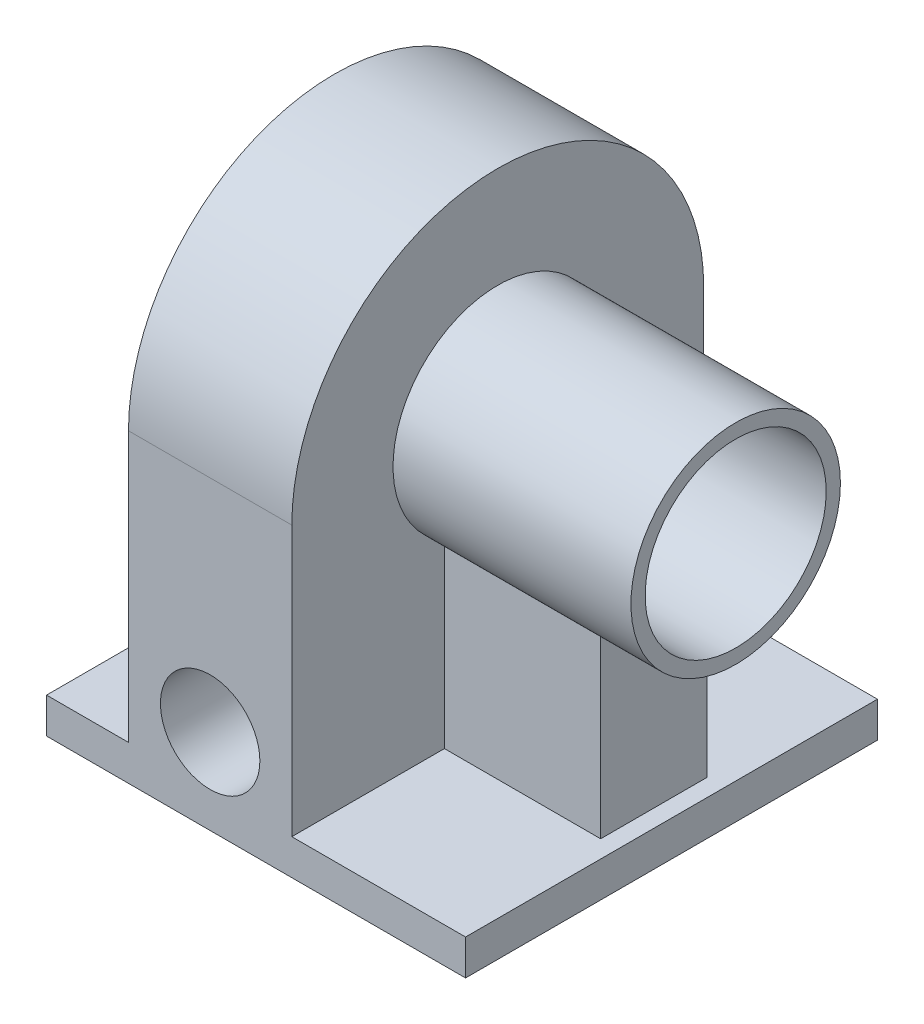
ISO-10303-21;
HEADER;
FILE_DESCRIPTION(('STEP AP214'),'2;1');
FILE_NAME('part.step','',(''),(''),'','','');
FILE_SCHEMA(('AUTOMOTIVE_DESIGN { 1 0 10303 214 1 1 1 1 }'));
ENDSEC;
DATA;
#1=APPLICATION_CONTEXT('core data for automotive mechanical design processes');
#2=APPLICATION_PROTOCOL_DEFINITION('international standard','automotive_design',2000,#1);
#3=PRODUCT_CONTEXT('',#1,'mechanical');
#4=PRODUCT('Part','Part','',(#3));
#5=PRODUCT_RELATED_PRODUCT_CATEGORY('part','',(#4));
#6=PRODUCT_DEFINITION_FORMATION('','',#4);
#7=PRODUCT_DEFINITION_CONTEXT('part definition',#1,'design');
#8=PRODUCT_DEFINITION('design','',#6,#7);
#9=PRODUCT_DEFINITION_SHAPE('','',#8);
#10=(LENGTH_UNIT() NAMED_UNIT(*) SI_UNIT(.MILLI.,.METRE.));
#11=(NAMED_UNIT(*) PLANE_ANGLE_UNIT() SI_UNIT($,.RADIAN.));
#12=(NAMED_UNIT(*) SI_UNIT($,.STERADIAN.) SOLID_ANGLE_UNIT());
#13=UNCERTAINTY_MEASURE_WITH_UNIT(LENGTH_MEASURE(1.E-05),#10,'distance_accuracy_value','');
#14=(GEOMETRIC_REPRESENTATION_CONTEXT(3) GLOBAL_UNCERTAINTY_ASSIGNED_CONTEXT((#13)) GLOBAL_UNIT_ASSIGNED_CONTEXT((#10,
#11,#12)) REPRESENTATION_CONTEXT('',''));
#15=CARTESIAN_POINT('',(0.,0.,0.));
#16=DIRECTION('',(0.,0.,1.));
#17=DIRECTION('',(1.,0.,0.));
#18=AXIS2_PLACEMENT_3D('',#15,#16,#17);
#19=CARTESIAN_POINT('',(-59.0733122187031,10.,-116.));
#20=DIRECTION('',(0.,1.,0.));
#21=DIRECTION('',(0.,0.,1.));
#22=AXIS2_PLACEMENT_3D('',#19,#20,#21);
#23=PLANE('',#22);
#24=DIRECTION('',(0.,0.,-1.));
#25=VECTOR('',#24,1.);
#26=CARTESIAN_POINT('',(54.,10.,-72.9751034213761));
#27=LINE('',#26,#25);
#28=CARTESIAN_POINT('',(54.,10.,-42.9751034213761));
#29=VERTEX_POINT('',#28);
#30=CARTESIAN_POINT('',(54.,10.,-72.9751034213761));
#31=VERTEX_POINT('',#30);
#32=EDGE_CURVE('E54',#29,#31,#27,.T.);
#33=ORIENTED_EDGE('',*,*,#32,.F.);
#34=DIRECTION('',(1.,0.,0.));
#35=VECTOR('',#34,1.);
#36=CARTESIAN_POINT('',(10.,10.,-42.9751034213761));
#37=LINE('',#36,#35);
#38=CARTESIAN_POINT('',(10.,10.,-42.9751034213761));
#39=VERTEX_POINT('',#38);
#40=EDGE_CURVE('E295',#39,#29,#37,.T.);
#41=ORIENTED_EDGE('',*,*,#40,.F.);
#42=DIRECTION('',(0.,0.,-1.));
#43=VECTOR('',#42,1.);
#44=CARTESIAN_POINT('',(10.,10.,0.));
#45=LINE('',#44,#43);
#46=CARTESIAN_POINT('',(10.,10.,0.));
#47=VERTEX_POINT('',#46);
#48=EDGE_CURVE('E169',#47,#39,#45,.T.);
#49=ORIENTED_EDGE('',*,*,#48,.F.);
#50=DIRECTION('',(-1.,0.,0.));
#51=VECTOR('',#50,1.);
#52=CARTESIAN_POINT('',(-59.0733122187031,10.,0.));
#53=LINE('',#52,#51);
#54=CARTESIAN_POINT('',(58.9266877812969,10.,0.));
#55=VERTEX_POINT('',#54);
#56=EDGE_CURVE('E214',#55,#47,#53,.T.);
#57=ORIENTED_EDGE('',*,*,#56,.F.);
#58=DIRECTION('',(0.,0.,1.));
#59=VECTOR('',#58,1.);
#60=CARTESIAN_POINT('',(58.9266877812969,10.,-116.));
#61=LINE('',#60,#59);
#62=CARTESIAN_POINT('',(58.9266877812969,10.,-116.));
#63=VERTEX_POINT('',#62);
#64=EDGE_CURVE('E224',#63,#55,#61,.T.);
#65=ORIENTED_EDGE('',*,*,#64,.F.);
#66=DIRECTION('',(-1.,0.,0.));
#67=VECTOR('',#66,1.);
#68=CARTESIAN_POINT('',(-59.0733122187031,10.,-116.));
#69=LINE('',#68,#67);
#70=CARTESIAN_POINT('',(10.,10.,-116.));
#71=VERTEX_POINT('',#70);
#72=EDGE_CURVE('E201',#63,#71,#69,.T.);
#73=ORIENTED_EDGE('',*,*,#72,.T.);
#74=CARTESIAN_POINT('',(10.,10.,-72.9751034213761));
#75=VERTEX_POINT('',#74);
#76=EDGE_CURVE('E186',#75,#71,#45,.T.);
#77=ORIENTED_EDGE('',*,*,#76,.F.);
#78=DIRECTION('',(-1.,0.,0.));
#79=VECTOR('',#78,1.);
#80=CARTESIAN_POINT('',(10.,10.,-72.9751034213761));
#81=LINE('',#80,#79);
#82=EDGE_CURVE('E59',#31,#75,#81,.T.);
#83=ORIENTED_EDGE('',*,*,#82,.F.);
#84=EDGE_LOOP('',(#33,#41,#49,#57,#65,#73,#77,#83));
#85=FACE_BOUND('',#84,.T.);
#86=ADVANCED_FACE('F39',(#85),#23,.T.);
#87=CARTESIAN_POINT('',(10.,0.,0.));
#88=DIRECTION('',(1.,0.,0.));
#89=DIRECTION('',(0.,0.,-1.));
#90=AXIS2_PLACEMENT_3D('',#87,#88,#89);
#91=PLANE('',#90);
#92=ORIENTED_EDGE('',*,*,#48,.T.);
#93=DIRECTION('',(0.,-1.,0.));
#94=VECTOR('',#93,1.);
#95=CARTESIAN_POINT('',(10.,65.,-42.9751034213761));
#96=LINE('',#95,#94);
#97=CARTESIAN_POINT('',(10.,60.6129465514082,-42.9751034213761));
#98=VERTEX_POINT('',#97);
#99=EDGE_CURVE('E147',#98,#39,#96,.T.);
#100=ORIENTED_EDGE('',*,*,#99,.F.);
#101=CARTESIAN_POINT('',(10.,86.,-58.));
#102=DIRECTION('',(1.,0.,0.));
#103=DIRECTION('',(0.,0.,-1.));
#104=AXIS2_PLACEMENT_3D('',#101,#102,#103);
#105=CIRCLE('',#104,29.5);
#106=CARTESIAN_POINT('',(10.,60.5835431753541,-72.9751034213761));
#107=VERTEX_POINT('',#106);
#108=EDGE_CURVE('E153',#107,#98,#105,.T.);
#109=ORIENTED_EDGE('',*,*,#108,.F.);
#110=DIRECTION('',(0.,-1.,0.));
#111=VECTOR('',#110,1.);
#112=CARTESIAN_POINT('',(10.,65.,-72.9751034213761));
#113=LINE('',#112,#111);
#114=EDGE_CURVE('E142',#107,#75,#113,.T.);
#115=ORIENTED_EDGE('',*,*,#114,.T.);
#116=ORIENTED_EDGE('',*,*,#76,.T.);
#117=DIRECTION('',(0.,1.,0.));
#118=VECTOR('',#117,1.);
#119=CARTESIAN_POINT('',(10.,0.,-116.));
#120=LINE('',#119,#118);
#121=CARTESIAN_POINT('',(10.,86.,-116.));
#122=VERTEX_POINT('',#121);
#123=EDGE_CURVE('E162',#71,#122,#120,.T.);
#124=ORIENTED_EDGE('',*,*,#123,.T.);
#125=CARTESIAN_POINT('',(10.,86.,-58.));
#126=DIRECTION('',(1.,0.,0.));
#127=DIRECTION('',(0.,0.,-1.));
#128=AXIS2_PLACEMENT_3D('',#125,#126,#127);
#129=CIRCLE('',#128,58.);
#130=CARTESIAN_POINT('',(10.,86.,0.));
#131=VERTEX_POINT('',#130);
#132=EDGE_CURVE('E180',#122,#131,#129,.T.);
#133=ORIENTED_EDGE('',*,*,#132,.T.);
#134=DIRECTION('',(0.,1.,0.));
#135=VECTOR('',#134,1.);
#136=CARTESIAN_POINT('',(10.,0.,0.));
#137=LINE('',#136,#135);
#138=EDGE_CURVE('E183',#47,#131,#137,.T.);
#139=ORIENTED_EDGE('',*,*,#138,.F.);
#140=EDGE_LOOP('',(#92,#100,#109,#115,#116,#124,#133,#139));
#141=FACE_BOUND('',#140,.T.);
#142=ADVANCED_FACE('F237',(#141),#91,.T.);
#143=CARTESIAN_POINT('',(77.,86.,-58.));
#144=DIRECTION('',(-1.,0.,0.));
#145=DIRECTION('',(0.,0.,1.));
#146=AXIS2_PLACEMENT_3D('',#143,#144,#145);
#147=CYLINDRICAL_SURFACE('',#146,29.5);
#148=CARTESIAN_POINT('',(77.,86.,-58.));
#149=DIRECTION('',(1.,0.,0.));
#150=DIRECTION('',(0.,0.,-1.));
#151=AXIS2_PLACEMENT_3D('',#148,#149,#150);
#152=CIRCLE('',#151,29.5);
#153=CARTESIAN_POINT('',(77.,86.,-87.5));
#154=VERTEX_POINT('',#153);
#155=EDGE_CURVE('E154',#154,#154,#152,.T.);
#156=ORIENTED_EDGE('',*,*,#155,.F.);
#157=EDGE_LOOP('',(#156));
#158=FACE_BOUND('',#157,.T.);
#159=DIRECTION('',(-1.,0.,0.));
#160=VECTOR('',#159,1.);
#161=CARTESIAN_POINT('',(77.,60.6129465514082,-42.9751034213761));
#162=LINE('',#161,#160);
#163=CARTESIAN_POINT('',(54.,60.6129465514082,-42.9751034213761));
#164=VERTEX_POINT('',#163);
#165=EDGE_CURVE('E11',#164,#98,#162,.T.);
#166=ORIENTED_EDGE('',*,*,#165,.F.);
#167=CARTESIAN_POINT('',(54.,86.,-58.));
#168=DIRECTION('',(-1.,0.,0.));
#169=DIRECTION('',(0.,0.,1.));
#170=AXIS2_PLACEMENT_3D('',#167,#168,#169);
#171=CIRCLE('',#170,29.5);
#172=CARTESIAN_POINT('',(54.,60.5835431753541,-72.9751034213761));
#173=VERTEX_POINT('',#172);
#174=EDGE_CURVE('E127',#173,#164,#171,.T.);
#175=ORIENTED_EDGE('',*,*,#174,.F.);
#176=DIRECTION('',(-1.,0.,0.));
#177=VECTOR('',#176,1.);
#178=CARTESIAN_POINT('',(77.,60.5835431753541,-72.9751034213761));
#179=LINE('',#178,#177);
#180=EDGE_CURVE('E47',#107,#173,#179,.F.);
#181=ORIENTED_EDGE('',*,*,#180,.F.);
#182=ORIENTED_EDGE('',*,*,#108,.T.);
#183=EDGE_LOOP('',(#166,#175,#181,#182));
#184=FACE_BOUND('',#183,.T.);
#185=ADVANCED_FACE('F129',(#158,#184),#147,.T.);
#186=CARTESIAN_POINT('',(77.,86.,-58.));
#187=DIRECTION('',(-1.,0.,0.));
#188=DIRECTION('',(0.,0.,1.));
#189=AXIS2_PLACEMENT_3D('',#186,#187,#188);
#190=CYLINDRICAL_SURFACE('',#189,25.5);
#191=CARTESIAN_POINT('',(9.99999999999999,86.,-58.));
#192=DIRECTION('',(1.,0.,0.));
#193=DIRECTION('',(0.,0.,-1.));
#194=AXIS2_PLACEMENT_3D('',#191,#192,#193);
#195=CIRCLE('',#194,25.5);
#196=CARTESIAN_POINT('',(9.99999999999999,86.,-83.5));
#197=VERTEX_POINT('',#196);
#198=EDGE_CURVE('E143',#197,#197,#195,.F.);
#199=ORIENTED_EDGE('',*,*,#198,.T.);
#200=EDGE_LOOP('',(#199));
#201=FACE_BOUND('',#200,.T.);
#202=CARTESIAN_POINT('',(77.,86.,-58.));
#203=DIRECTION('',(1.,0.,0.));
#204=DIRECTION('',(0.,0.,-1.));
#205=AXIS2_PLACEMENT_3D('',#202,#203,#204);
#206=CIRCLE('',#205,25.5);
#207=CARTESIAN_POINT('',(77.,86.,-83.5));
#208=VERTEX_POINT('',#207);
#209=EDGE_CURVE('E135',#208,#208,#206,.T.);
#210=ORIENTED_EDGE('',*,*,#209,.T.);
#211=EDGE_LOOP('',(#210));
#212=FACE_BOUND('',#211,.T.);
#213=ADVANCED_FACE('F230',(#201,#212),#190,.F.);
#214=ORIENTED_EDGE('',*,*,#198,.F.);
#215=EDGE_LOOP('',(#214));
#216=FACE_BOUND('',#215,.T.);
#217=ADVANCED_FACE('F233',(#216),#91,.T.);
#218=CARTESIAN_POINT('',(-36.,10.,0.));
#219=VERTEX_POINT('',#218);
#220=CARTESIAN_POINT('',(-59.0733122187031,10.,0.));
#221=VERTEX_POINT('',#220);
#222=EDGE_CURVE('E213',#219,#221,#53,.T.);
#223=ORIENTED_EDGE('',*,*,#222,.F.);
#224=DIRECTION('',(0.,0.,-1.));
#225=VECTOR('',#224,1.);
#226=CARTESIAN_POINT('',(-36.,10.,0.));
#227=LINE('',#226,#225);
#228=CARTESIAN_POINT('',(-36.,10.,-116.));
#229=VERTEX_POINT('',#228);
#230=EDGE_CURVE('E174',#219,#229,#227,.T.);
#231=ORIENTED_EDGE('',*,*,#230,.T.);
#232=CARTESIAN_POINT('',(-59.0733122187031,10.,-116.));
#233=VERTEX_POINT('',#232);
#234=EDGE_CURVE('E200',#229,#233,#69,.T.);
#235=ORIENTED_EDGE('',*,*,#234,.T.);
#236=DIRECTION('',(0.,0.,1.));
#237=VECTOR('',#236,1.);
#238=CARTESIAN_POINT('',(-59.0733122187031,10.,-116.));
#239=LINE('',#238,#237);
#240=EDGE_CURVE('E221',#233,#221,#239,.T.);
#241=ORIENTED_EDGE('',*,*,#240,.T.);
#242=EDGE_LOOP('',(#223,#231,#235,#241));
#243=FACE_BOUND('',#242,.T.);
#244=ADVANCED_FACE('F235',(#243),#23,.T.);
#245=CARTESIAN_POINT('',(58.9266877812969,0.,-116.));
#246=DIRECTION('',(0.,-1.,0.));
#247=DIRECTION('',(1.,0.,0.));
#248=AXIS2_PLACEMENT_3D('',#245,#246,#247);
#249=PLANE('',#248);
#250=DIRECTION('',(1.,0.,0.));
#251=VECTOR('',#250,1.);
#252=CARTESIAN_POINT('',(58.9266877812969,0.,0.));
#253=LINE('',#252,#251);
#254=CARTESIAN_POINT('',(-59.0733122187031,0.,0.));
#255=VERTEX_POINT('',#254);
#256=CARTESIAN_POINT('',(58.9266877812969,0.,0.));
#257=VERTEX_POINT('',#256);
#258=EDGE_CURVE('E191',#255,#257,#253,.T.);
#259=ORIENTED_EDGE('',*,*,#258,.F.);
#260=DIRECTION('',(0.,0.,1.));
#261=VECTOR('',#260,1.);
#262=CARTESIAN_POINT('',(-59.0733122187031,0.,-116.));
#263=LINE('',#262,#261);
#264=CARTESIAN_POINT('',(-59.0733122187031,0.,-116.));
#265=VERTEX_POINT('',#264);
#266=EDGE_CURVE('E219',#265,#255,#263,.T.);
#267=ORIENTED_EDGE('',*,*,#266,.F.);
#268=DIRECTION('',(1.,0.,0.));
#269=VECTOR('',#268,1.);
#270=CARTESIAN_POINT('',(58.9266877812969,0.,-116.));
#271=LINE('',#270,#269);
#272=CARTESIAN_POINT('',(58.9266877812969,0.,-116.));
#273=VERTEX_POINT('',#272);
#274=EDGE_CURVE('E193',#265,#273,#271,.T.);
#275=ORIENTED_EDGE('',*,*,#274,.T.);
#276=DIRECTION('',(0.,0.,1.));
#277=VECTOR('',#276,1.);
#278=CARTESIAN_POINT('',(58.9266877812969,0.,-116.));
#279=LINE('',#278,#277);
#280=EDGE_CURVE('E207',#273,#257,#279,.T.);
#281=ORIENTED_EDGE('',*,*,#280,.T.);
#282=EDGE_LOOP('',(#259,#267,#275,#281));
#283=FACE_BOUND('',#282,.T.);
#284=ADVANCED_FACE('F41',(#283),#249,.T.);
#285=CARTESIAN_POINT('',(-59.0733122187031,0.,-116.));
#286=DIRECTION('',(-1.,0.,0.));
#287=DIRECTION('',(0.,0.,1.));
#288=AXIS2_PLACEMENT_3D('',#285,#286,#287);
#289=PLANE('',#288);
#290=DIRECTION('',(0.,-1.,0.));
#291=VECTOR('',#290,1.);
#292=CARTESIAN_POINT('',(-59.0733122187031,0.,0.));
#293=LINE('',#292,#291);
#294=EDGE_CURVE('E197',#221,#255,#293,.T.);
#295=ORIENTED_EDGE('',*,*,#294,.F.);
#296=ORIENTED_EDGE('',*,*,#240,.F.);
#297=DIRECTION('',(0.,-1.,0.));
#298=VECTOR('',#297,1.);
#299=CARTESIAN_POINT('',(-59.0733122187031,0.,-116.));
#300=LINE('',#299,#298);
#301=EDGE_CURVE('E204',#233,#265,#300,.T.);
#302=ORIENTED_EDGE('',*,*,#301,.T.);
#303=ORIENTED_EDGE('',*,*,#266,.T.);
#304=EDGE_LOOP('',(#295,#296,#302,#303));
#305=FACE_BOUND('',#304,.T.);
#306=ADVANCED_FACE('F253',(#305),#289,.T.);
#307=CARTESIAN_POINT('',(58.9266877812969,10.,-116.));
#308=DIRECTION('',(1.,0.,0.));
#309=DIRECTION('',(0.,0.,-1.));
#310=AXIS2_PLACEMENT_3D('',#307,#308,#309);
#311=PLANE('',#310);
#312=DIRECTION('',(0.,1.,0.));
#313=VECTOR('',#312,1.);
#314=CARTESIAN_POINT('',(58.9266877812969,10.,0.));
#315=LINE('',#314,#313);
#316=EDGE_CURVE('E210',#257,#55,#315,.T.);
#317=ORIENTED_EDGE('',*,*,#316,.F.);
#318=ORIENTED_EDGE('',*,*,#280,.F.);
#319=DIRECTION('',(0.,1.,0.));
#320=VECTOR('',#319,1.);
#321=CARTESIAN_POINT('',(58.9266877812969,10.,-116.));
#322=LINE('',#321,#320);
#323=EDGE_CURVE('E196',#273,#63,#322,.T.);
#324=ORIENTED_EDGE('',*,*,#323,.T.);
#325=ORIENTED_EDGE('',*,*,#64,.T.);
#326=EDGE_LOOP('',(#317,#318,#324,#325));
#327=FACE_BOUND('',#326,.T.);
#328=ADVANCED_FACE('F255',(#327),#311,.T.);
#329=CARTESIAN_POINT('',(0.,0.,-116.));
#330=DIRECTION('',(0.,0.,-1.));
#331=DIRECTION('',(-1.,0.,0.));
#332=AXIS2_PLACEMENT_3D('',#329,#330,#331);
#333=PLANE('',#332);
#334=CARTESIAN_POINT('',(-13.,24.,-116.));
#335=DIRECTION('',(0.,0.,1.));
#336=DIRECTION('',(1.,0.,0.));
#337=AXIS2_PLACEMENT_3D('',#334,#335,#336);
#338=CIRCLE('',#337,14.);
#339=CARTESIAN_POINT('',(1.,24.,-116.));
#340=VERTEX_POINT('',#339);
#341=EDGE_CURVE('E159',#340,#340,#338,.T.);
#342=ORIENTED_EDGE('',*,*,#341,.T.);
#343=EDGE_LOOP('',(#342));
#344=FACE_BOUND('',#343,.T.);
#345=ORIENTED_EDGE('',*,*,#274,.F.);
#346=ORIENTED_EDGE('',*,*,#301,.F.);
#347=ORIENTED_EDGE('',*,*,#234,.F.);
#348=DIRECTION('',(0.,1.,0.));
#349=VECTOR('',#348,1.);
#350=CARTESIAN_POINT('',(-36.,0.,-116.));
#351=LINE('',#350,#349);
#352=CARTESIAN_POINT('',(-36.,86.,-116.));
#353=VERTEX_POINT('',#352);
#354=EDGE_CURVE('E165',#229,#353,#351,.T.);
#355=ORIENTED_EDGE('',*,*,#354,.T.);
#356=DIRECTION('',(1.,0.,0.));
#357=VECTOR('',#356,1.);
#358=CARTESIAN_POINT('',(-36.,86.,-116.));
#359=LINE('',#358,#357);
#360=EDGE_CURVE('E177',#353,#122,#359,.T.);
#361=ORIENTED_EDGE('',*,*,#360,.T.);
#362=ORIENTED_EDGE('',*,*,#123,.F.);
#363=ORIENTED_EDGE('',*,*,#72,.F.);
#364=ORIENTED_EDGE('',*,*,#323,.F.);
#365=EDGE_LOOP('',(#345,#346,#347,#355,#361,#362,#363,#364));
#366=FACE_BOUND('',#365,.T.);
#367=ADVANCED_FACE('F257',(#344,#366),#333,.T.);
#368=CARTESIAN_POINT('',(0.,0.,0.));
#369=DIRECTION('',(0.,0.,-1.));
#370=DIRECTION('',(-1.,0.,0.));
#371=AXIS2_PLACEMENT_3D('',#368,#369,#370);
#372=PLANE('',#371);
#373=CARTESIAN_POINT('',(-13.,24.,0.));
#374=DIRECTION('',(0.,0.,1.));
#375=DIRECTION('',(1.,0.,0.));
#376=AXIS2_PLACEMENT_3D('',#373,#374,#375);
#377=CIRCLE('',#376,14.);
#378=CARTESIAN_POINT('',(1.,24.,0.));
#379=VERTEX_POINT('',#378);
#380=EDGE_CURVE('E157',#379,#379,#377,.T.);
#381=ORIENTED_EDGE('',*,*,#380,.F.);
#382=EDGE_LOOP('',(#381));
#383=FACE_BOUND('',#382,.T.);
#384=ORIENTED_EDGE('',*,*,#258,.T.);
#385=ORIENTED_EDGE('',*,*,#316,.T.);
#386=ORIENTED_EDGE('',*,*,#56,.T.);
#387=ORIENTED_EDGE('',*,*,#138,.T.);
#388=DIRECTION('',(1.,0.,0.));
#389=VECTOR('',#388,1.);
#390=CARTESIAN_POINT('',(-36.,86.,0.));
#391=LINE('',#390,#389);
#392=CARTESIAN_POINT('',(-36.,86.,0.));
#393=VERTEX_POINT('',#392);
#394=EDGE_CURVE('E189',#393,#131,#391,.T.);
#395=ORIENTED_EDGE('',*,*,#394,.F.);
#396=DIRECTION('',(0.,1.,0.));
#397=VECTOR('',#396,1.);
#398=CARTESIAN_POINT('',(-36.,0.,0.));
#399=LINE('',#398,#397);
#400=EDGE_CURVE('E172',#219,#393,#399,.T.);
#401=ORIENTED_EDGE('',*,*,#400,.F.);
#402=ORIENTED_EDGE('',*,*,#222,.T.);
#403=ORIENTED_EDGE('',*,*,#294,.T.);
#404=EDGE_LOOP('',(#384,#385,#386,#387,#395,#401,#402,#403));
#405=FACE_BOUND('',#404,.T.);
#406=ADVANCED_FACE('F263',(#383,#405),#372,.F.);
#407=CARTESIAN_POINT('',(-36.,86.,-58.));
#408=DIRECTION('',(1.,0.,0.));
#409=DIRECTION('',(0.,0.,-1.));
#410=AXIS2_PLACEMENT_3D('',#407,#408,#409);
#411=CYLINDRICAL_SURFACE('',#410,58.);
#412=ORIENTED_EDGE('',*,*,#132,.F.);
#413=ORIENTED_EDGE('',*,*,#360,.F.);
#414=CARTESIAN_POINT('',(-36.,86.,-58.));
#415=DIRECTION('',(1.,0.,0.));
#416=DIRECTION('',(0.,0.,-1.));
#417=AXIS2_PLACEMENT_3D('',#414,#415,#416);
#418=CIRCLE('',#417,58.);
#419=EDGE_CURVE('E168',#353,#393,#418,.T.);
#420=ORIENTED_EDGE('',*,*,#419,.T.);
#421=ORIENTED_EDGE('',*,*,#394,.T.);
#422=EDGE_LOOP('',(#412,#413,#420,#421));
#423=FACE_BOUND('',#422,.T.);
#424=ADVANCED_FACE('F289',(#423),#411,.T.);
#425=CARTESIAN_POINT('',(-36.,0.,0.));
#426=DIRECTION('',(1.,0.,0.));
#427=DIRECTION('',(0.,0.,-1.));
#428=AXIS2_PLACEMENT_3D('',#425,#426,#427);
#429=PLANE('',#428);
#430=ORIENTED_EDGE('',*,*,#354,.F.);
#431=ORIENTED_EDGE('',*,*,#230,.F.);
#432=ORIENTED_EDGE('',*,*,#400,.T.);
#433=ORIENTED_EDGE('',*,*,#419,.F.);
#434=EDGE_LOOP('',(#430,#431,#432,#433));
#435=FACE_BOUND('',#434,.T.);
#436=ADVANCED_FACE('F286',(#435),#429,.F.);
#437=CARTESIAN_POINT('',(-13.,24.,-116.));
#438=DIRECTION('',(0.,0.,1.));
#439=DIRECTION('',(1.,0.,0.));
#440=AXIS2_PLACEMENT_3D('',#437,#438,#439);
#441=CYLINDRICAL_SURFACE('',#440,14.);
#442=CARTESIAN_POINT('',(1.,24.,-116.));
#443=CARTESIAN_POINT('',(1.,24.,-114.791666666667));
#444=CARTESIAN_POINT('',(1.,24.,-113.583333333333));
#445=CARTESIAN_POINT('',(1.,24.,-111.166666666667));
#446=CARTESIAN_POINT('',(1.,24.,-109.958333333333));
#447=CARTESIAN_POINT('',(1.,24.,-107.541666666667));
#448=CARTESIAN_POINT('',(1.,24.,-106.333333333333));
#449=CARTESIAN_POINT('',(1.,24.,-103.916666666667));
#450=CARTESIAN_POINT('',(1.,24.,-102.708333333333));
#451=CARTESIAN_POINT('',(1.,24.,-100.291666666667));
#452=CARTESIAN_POINT('',(1.,24.,-99.0833333333333));
#453=CARTESIAN_POINT('',(1.,24.,-96.6666666666667));
#454=CARTESIAN_POINT('',(1.,24.,-95.4583333333334));
#455=CARTESIAN_POINT('',(1.,24.,-93.0416666666667));
#456=CARTESIAN_POINT('',(1.,24.,-91.8333333333334));
#457=CARTESIAN_POINT('',(1.,24.,-89.4166666666667));
#458=CARTESIAN_POINT('',(1.,24.,-88.2083333333333));
#459=CARTESIAN_POINT('',(1.,24.,-85.7916666666667));
#460=CARTESIAN_POINT('',(1.,24.,-84.5833333333333));
#461=CARTESIAN_POINT('',(1.,24.,-82.1666666666667));
#462=CARTESIAN_POINT('',(1.,24.,-80.9583333333333));
#463=CARTESIAN_POINT('',(1.,24.,-78.5416666666667));
#464=CARTESIAN_POINT('',(1.,24.,-77.3333333333334));
#465=CARTESIAN_POINT('',(1.,24.,-74.9166666666667));
#466=CARTESIAN_POINT('',(1.,24.,-73.7083333333333));
#467=CARTESIAN_POINT('',(1.,24.,-71.2916666666667));
#468=CARTESIAN_POINT('',(1.,24.,-70.0833333333333));
#469=CARTESIAN_POINT('',(1.,24.,-67.6666666666667));
#470=CARTESIAN_POINT('',(1.,24.,-66.4583333333333));
#471=CARTESIAN_POINT('',(1.,24.,-64.0416666666667));
#472=CARTESIAN_POINT('',(1.,24.,-62.8333333333333));
#473=CARTESIAN_POINT('',(1.,24.,-60.4166666666667));
#474=CARTESIAN_POINT('',(1.,24.,-59.2083333333333));
#475=CARTESIAN_POINT('',(1.,24.,-56.7916666666667));
#476=CARTESIAN_POINT('',(1.,24.,-55.5833333333333));
#477=CARTESIAN_POINT('',(1.,24.,-53.1666666666667));
#478=CARTESIAN_POINT('',(1.,24.,-51.9583333333333));
#479=CARTESIAN_POINT('',(1.,24.,-49.5416666666667));
#480=CARTESIAN_POINT('',(1.,24.,-48.3333333333333));
#481=CARTESIAN_POINT('',(1.,24.,-45.9166666666667));
#482=CARTESIAN_POINT('',(1.,24.,-44.7083333333333));
#483=CARTESIAN_POINT('',(1.,24.,-42.2916666666667));
#484=CARTESIAN_POINT('',(1.,24.,-41.0833333333333));
#485=CARTESIAN_POINT('',(1.,24.,-38.6666666666667));
#486=CARTESIAN_POINT('',(1.,24.,-37.4583333333333));
#487=CARTESIAN_POINT('',(1.,24.,-35.0416666666667));
#488=CARTESIAN_POINT('',(1.,24.,-33.8333333333333));
#489=CARTESIAN_POINT('',(1.,24.,-31.4166666666667));
#490=CARTESIAN_POINT('',(1.,24.,-30.2083333333333));
#491=CARTESIAN_POINT('',(1.,24.,-27.7916666666667));
#492=CARTESIAN_POINT('',(1.,24.,-26.5833333333333));
#493=CARTESIAN_POINT('',(1.,24.,-24.1666666666667));
#494=CARTESIAN_POINT('',(1.,24.,-22.9583333333333));
#495=CARTESIAN_POINT('',(1.,24.,-20.5416666666667));
#496=CARTESIAN_POINT('',(1.,24.,-19.3333333333333));
#497=CARTESIAN_POINT('',(1.,24.,-16.9166666666667));
#498=CARTESIAN_POINT('',(1.,24.,-15.7083333333333));
#499=CARTESIAN_POINT('',(1.,24.,-13.2916666666667));
#500=CARTESIAN_POINT('',(1.,24.,-12.0833333333333));
#501=CARTESIAN_POINT('',(1.,24.,-9.66666666666667));
#502=CARTESIAN_POINT('',(1.,24.,-8.45833333333334));
#503=CARTESIAN_POINT('',(1.,24.,-6.04166666666667));
#504=CARTESIAN_POINT('',(1.,24.,-4.83333333333334));
#505=CARTESIAN_POINT('',(1.,24.,-2.41666666666667));
#506=CARTESIAN_POINT('',(1.,24.,-1.20833333333333));
#507=CARTESIAN_POINT('',(1.,24.,0.));
#508=B_SPLINE_CURVE_WITH_KNOTS('',3,(#442,#443,#444,#445,#446,#447,#448,#449,#450,#451,#452,
#453,#454,#455,#456,#457,#458,#459,#460,#461,#462,#463,#464,#465,#466,#467,#468,#469,#470,#471,
#472,#473,#474,#475,#476,#477,#478,#479,#480,#481,#482,#483,#484,#485,#486,#487,#488,#489,#490,
#491,#492,#493,#494,#495,#496,#497,#498,#499,#500,#501,#502,#503,#504,#505,#506,#507),
.UNSPECIFIED.,.F.,.F.,(4,2,2,2,2,2,2,2,2,2,2,2,2,2,2,2,2,2,2,2,2,2,2,2,2,2,2,2,2,2,2,2,4),(0.,
3.62499999999999,7.24999999999999,10.875,14.5,18.125,21.75,25.375,29.,32.625,36.25,39.875,43.5,
47.125,50.75,54.375,58.,61.625,65.25,68.875,72.5,76.125,79.75,83.375,87.,90.625,94.25,97.875,
101.5,105.125,108.75,112.375,116.),.UNSPECIFIED.);
#509=EDGE_CURVE('BSEAM307',#340,#379,#508,.T.);
#510=ORIENTED_EDGE('',*,*,#341,.F.);
#511=ORIENTED_EDGE('',*,*,#380,.T.);
#512=ORIENTED_EDGE('',*,*,#509,.T.);
#513=ORIENTED_EDGE('',*,*,#509,.F.);
#514=EDGE_LOOP('',(#510,#512,#511,#513));
#515=FACE_BOUND('',#514,.T.);
#516=ADVANCED_FACE('F307',(#515),#441,.F.);
#517=CARTESIAN_POINT('',(77.,86.,-58.));
#518=DIRECTION('',(1.,0.,0.));
#519=DIRECTION('',(0.,0.,-1.));
#520=AXIS2_PLACEMENT_3D('',#517,#518,#519);
#521=PLANE('',#520);
#522=ORIENTED_EDGE('',*,*,#155,.T.);
#523=EDGE_LOOP('',(#522));
#524=FACE_BOUND('',#523,.T.);
#525=ORIENTED_EDGE('',*,*,#209,.F.);
#526=EDGE_LOOP('',(#525));
#527=FACE_BOUND('',#526,.T.);
#528=ADVANCED_FACE('F300',(#524,#527),#521,.T.);
#529=CARTESIAN_POINT('',(10.,65.,-42.9751034213761));
#530=DIRECTION('',(0.,0.,-1.));
#531=DIRECTION('',(-1.,0.,0.));
#532=AXIS2_PLACEMENT_3D('',#529,#530,#531);
#533=PLANE('',#532);
#534=DIRECTION('',(0.,-1.,0.));
#535=VECTOR('',#534,1.);
#536=CARTESIAN_POINT('',(54.,65.,-42.9751034213761));
#537=LINE('',#536,#535);
#538=EDGE_CURVE('E136',#164,#29,#537,.T.);
#539=ORIENTED_EDGE('',*,*,#538,.F.);
#540=ORIENTED_EDGE('',*,*,#165,.T.);
#541=ORIENTED_EDGE('',*,*,#99,.T.);
#542=ORIENTED_EDGE('',*,*,#40,.T.);
#543=EDGE_LOOP('',(#539,#540,#541,#542));
#544=FACE_BOUND('',#543,.T.);
#545=ADVANCED_FACE('F294',(#544),#533,.F.);
#546=CARTESIAN_POINT('',(10.,65.,-72.9751034213761));
#547=DIRECTION('',(0.,0.,1.));
#548=DIRECTION('',(1.,0.,0.));
#549=AXIS2_PLACEMENT_3D('',#546,#547,#548);
#550=PLANE('',#549);
#551=ORIENTED_EDGE('',*,*,#114,.F.);
#552=ORIENTED_EDGE('',*,*,#180,.T.);
#553=DIRECTION('',(0.,-1.,0.));
#554=VECTOR('',#553,1.);
#555=CARTESIAN_POINT('',(54.,65.,-72.9751034213761));
#556=LINE('',#555,#554);
#557=EDGE_CURVE('E141',#173,#31,#556,.T.);
#558=ORIENTED_EDGE('',*,*,#557,.T.);
#559=ORIENTED_EDGE('',*,*,#82,.T.);
#560=EDGE_LOOP('',(#551,#552,#558,#559));
#561=FACE_BOUND('',#560,.T.);
#562=ADVANCED_FACE('F140',(#561),#550,.F.);
#563=CARTESIAN_POINT('',(54.,65.,-72.9751034213761));
#564=DIRECTION('',(-1.,0.,0.));
#565=DIRECTION('',(0.,0.,1.));
#566=AXIS2_PLACEMENT_3D('',#563,#564,#565);
#567=PLANE('',#566);
#568=ORIENTED_EDGE('',*,*,#557,.F.);
#569=ORIENTED_EDGE('',*,*,#174,.T.);
#570=ORIENTED_EDGE('',*,*,#538,.T.);
#571=ORIENTED_EDGE('',*,*,#32,.T.);
#572=EDGE_LOOP('',(#568,#569,#570,#571));
#573=FACE_BOUND('',#572,.T.);
#574=ADVANCED_FACE('F144',(#573),#567,.F.);
#575=CLOSED_SHELL('',(#86,#142,#185,#213,#217,#244,#284,#306,#328,#367,#406,#424,#436,#516,#528,
#545,#562,#574));
#576=MANIFOLD_SOLID_BREP('B2',#575);
#577=ADVANCED_BREP_SHAPE_REPRESENTATION('',(#18,#576),#14);
#578=SHAPE_DEFINITION_REPRESENTATION(#9,#577);
ENDSEC;
END-ISO-10303-21;
